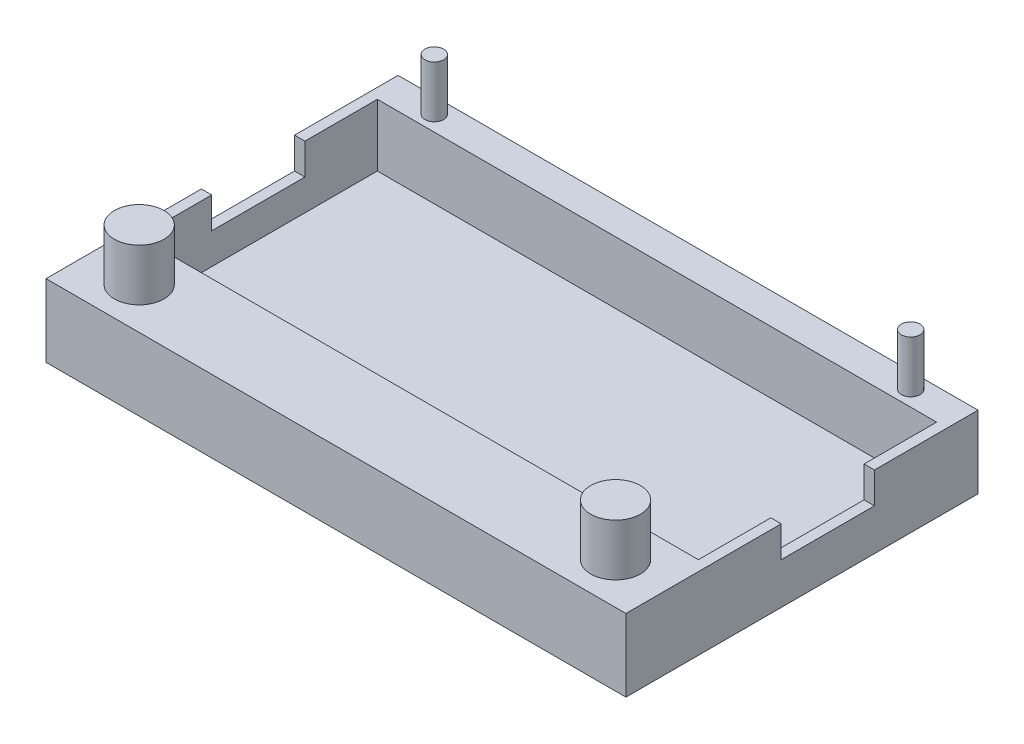
ISO-10303-21;
HEADER;
FILE_DESCRIPTION(('STEP AP214'),'2;1');
FILE_NAME('part.step','',(''),(''),'','','');
FILE_SCHEMA(('AUTOMOTIVE_DESIGN { 1 0 10303 214 1 1 1 1 }'));
ENDSEC;
DATA;
#1=APPLICATION_CONTEXT('core data for automotive mechanical design processes');
#2=APPLICATION_PROTOCOL_DEFINITION('international standard','automotive_design',2000,#1);
#3=PRODUCT_CONTEXT('',#1,'mechanical');
#4=PRODUCT('Part','Part','',(#3));
#5=PRODUCT_RELATED_PRODUCT_CATEGORY('part','',(#4));
#6=PRODUCT_DEFINITION_FORMATION('','',#4);
#7=PRODUCT_DEFINITION_CONTEXT('part definition',#1,'design');
#8=PRODUCT_DEFINITION('design','',#6,#7);
#9=PRODUCT_DEFINITION_SHAPE('','',#8);
#10=(LENGTH_UNIT() NAMED_UNIT(*) SI_UNIT(.MILLI.,.METRE.));
#11=(NAMED_UNIT(*) PLANE_ANGLE_UNIT() SI_UNIT($,.RADIAN.));
#12=(NAMED_UNIT(*) SI_UNIT($,.STERADIAN.) SOLID_ANGLE_UNIT());
#13=UNCERTAINTY_MEASURE_WITH_UNIT(LENGTH_MEASURE(1.E-05),#10,'distance_accuracy_value','');
#14=(GEOMETRIC_REPRESENTATION_CONTEXT(3) GLOBAL_UNCERTAINTY_ASSIGNED_CONTEXT((#13)) GLOBAL_UNIT_ASSIGNED_CONTEXT((#10,
#11,#12)) REPRESENTATION_CONTEXT('',''));
#15=CARTESIAN_POINT('',(0.,0.,0.));
#16=DIRECTION('',(0.,0.,1.));
#17=DIRECTION('',(1.,0.,0.));
#18=AXIS2_PLACEMENT_3D('',#15,#16,#17);
#19=CARTESIAN_POINT('',(0.,4.,0.));
#20=DIRECTION('',(0.,1.,0.));
#21=DIRECTION('',(0.,0.,1.));
#22=AXIS2_PLACEMENT_3D('',#19,#20,#21);
#23=PLANE('',#22);
#24=DIRECTION('',(0.,0.,-1.));
#25=VECTOR('',#24,1.);
#26=CARTESIAN_POINT('',(0.,4.,-32.));
#27=LINE('',#26,#25);
#28=CARTESIAN_POINT('',(0.,4.,-15.));
#29=VERTEX_POINT('',#28);
#30=CARTESIAN_POINT('',(0.,4.,-24.));
#31=VERTEX_POINT('',#30);
#32=EDGE_CURVE('E329',#29,#31,#27,.T.);
#33=ORIENTED_EDGE('',*,*,#32,.T.);
#34=DIRECTION('',(1.,0.,0.));
#35=VECTOR('',#34,1.);
#36=CARTESIAN_POINT('',(0.,4.,-24.));
#37=LINE('',#36,#35);
#38=CARTESIAN_POINT('',(-1.,4.,-24.));
#39=VERTEX_POINT('',#38);
#40=EDGE_CURVE('E188',#39,#31,#37,.T.);
#41=ORIENTED_EDGE('',*,*,#40,.F.);
#42=DIRECTION('',(0.,0.,-1.));
#43=VECTOR('',#42,1.);
#44=CARTESIAN_POINT('',(-1.,4.,-31.));
#45=LINE('',#44,#43);
#46=CARTESIAN_POINT('',(-1.,4.,-15.));
#47=VERTEX_POINT('',#46);
#48=EDGE_CURVE('E295',#47,#39,#45,.T.);
#49=ORIENTED_EDGE('',*,*,#48,.F.);
#50=DIRECTION('',(-1.,0.,0.));
#51=VECTOR('',#50,1.);
#52=CARTESIAN_POINT('',(0.,4.,-15.));
#53=LINE('',#52,#51);
#54=EDGE_CURVE('E69',#29,#47,#53,.T.);
#55=ORIENTED_EDGE('',*,*,#54,.F.);
#56=EDGE_LOOP('',(#33,#41,#49,#55));
#57=FACE_BOUND('',#56,.T.);
#58=ADVANCED_FACE('F45',(#57),#23,.T.);
#59=DIRECTION('',(0.,0.,1.));
#60=VECTOR('',#59,1.);
#61=CARTESIAN_POINT('',(-55.,4.,-31.));
#62=LINE('',#61,#60);
#63=CARTESIAN_POINT('',(-55.,4.,-24.));
#64=VERTEX_POINT('',#63);
#65=CARTESIAN_POINT('',(-55.,4.,-15.));
#66=VERTEX_POINT('',#65);
#67=EDGE_CURVE('E61',#64,#66,#62,.T.);
#68=ORIENTED_EDGE('',*,*,#67,.F.);
#69=DIRECTION('',(1.,0.,0.));
#70=VECTOR('',#69,1.);
#71=CARTESIAN_POINT('',(0.,4.,-24.));
#72=LINE('',#71,#70);
#73=CARTESIAN_POINT('',(-56.,4.,-24.));
#74=VERTEX_POINT('',#73);
#75=EDGE_CURVE('E211',#74,#64,#72,.T.);
#76=ORIENTED_EDGE('',*,*,#75,.F.);
#77=DIRECTION('',(0.,0.,1.));
#78=VECTOR('',#77,1.);
#79=CARTESIAN_POINT('',(-56.,4.,-32.));
#80=LINE('',#79,#78);
#81=CARTESIAN_POINT('',(-56.,4.,-15.));
#82=VERTEX_POINT('',#81);
#83=EDGE_CURVE('E326',#74,#82,#80,.T.);
#84=ORIENTED_EDGE('',*,*,#83,.T.);
#85=DIRECTION('',(-1.,0.,0.));
#86=VECTOR('',#85,1.);
#87=CARTESIAN_POINT('',(0.,4.,-15.));
#88=LINE('',#87,#86);
#89=EDGE_CURVE('E246',#66,#82,#88,.T.);
#90=ORIENTED_EDGE('',*,*,#89,.F.);
#91=EDGE_LOOP('',(#68,#76,#84,#90));
#92=FACE_BOUND('',#91,.T.);
#93=ADVANCED_FACE('F380',(#92),#23,.T.);
#94=CARTESIAN_POINT('',(-56.,1.,-32.));
#95=DIRECTION('',(1.,0.,0.));
#96=DIRECTION('',(0.,0.,-1.));
#97=AXIS2_PLACEMENT_3D('',#94,#95,#96);
#98=PLANE('',#97);
#99=DIRECTION('',(0.,0.,1.));
#100=VECTOR('',#99,1.);
#101=CARTESIAN_POINT('',(-56.,0.,-32.));
#102=LINE('',#101,#100);
#103=CARTESIAN_POINT('',(-56.,0.,-34.));
#104=VERTEX_POINT('',#103);
#105=CARTESIAN_POINT('',(-56.,0.,0.));
#106=VERTEX_POINT('',#105);
#107=EDGE_CURVE('E332',#104,#106,#102,.T.);
#108=ORIENTED_EDGE('',*,*,#107,.T.);
#109=DIRECTION('',(0.,-1.,0.));
#110=VECTOR('',#109,1.);
#111=CARTESIAN_POINT('',(-56.,1.,0.));
#112=LINE('',#111,#110);
#113=CARTESIAN_POINT('',(-56.,7.,0.));
#114=VERTEX_POINT('',#113);
#115=EDGE_CURVE('E11',#114,#106,#112,.T.);
#116=ORIENTED_EDGE('',*,*,#115,.F.);
#117=DIRECTION('',(0.,0.,-1.));
#118=VECTOR('',#117,1.);
#119=CARTESIAN_POINT('',(-56.,7.,0.));
#120=LINE('',#119,#118);
#121=CARTESIAN_POINT('',(-56.,7.,-15.));
#122=VERTEX_POINT('',#121);
#123=EDGE_CURVE('E263',#114,#122,#120,.T.);
#124=ORIENTED_EDGE('',*,*,#123,.T.);
#125=DIRECTION('',(0.,-1.,0.));
#126=VECTOR('',#125,1.);
#127=CARTESIAN_POINT('',(-56.,7.,-15.));
#128=LINE('',#127,#126);
#129=EDGE_CURVE('E271',#122,#82,#128,.T.);
#130=ORIENTED_EDGE('',*,*,#129,.T.);
#131=ORIENTED_EDGE('',*,*,#83,.F.);
#132=DIRECTION('',(0.,-1.,0.));
#133=VECTOR('',#132,1.);
#134=CARTESIAN_POINT('',(-56.,7.,-24.));
#135=LINE('',#134,#133);
#136=CARTESIAN_POINT('',(-56.,7.,-24.));
#137=VERTEX_POINT('',#136);
#138=EDGE_CURVE('E233',#137,#74,#135,.T.);
#139=ORIENTED_EDGE('',*,*,#138,.F.);
#140=DIRECTION('',(0.,0.,-1.));
#141=VECTOR('',#140,1.);
#142=CARTESIAN_POINT('',(-56.,7.,0.));
#143=LINE('',#142,#141);
#144=CARTESIAN_POINT('',(-56.,7.,-34.));
#145=VERTEX_POINT('',#144);
#146=EDGE_CURVE('E176',#137,#145,#143,.T.);
#147=ORIENTED_EDGE('',*,*,#146,.T.);
#148=DIRECTION('',(0.,-1.,0.));
#149=VECTOR('',#148,1.);
#150=CARTESIAN_POINT('',(-56.,7.,-34.));
#151=LINE('',#150,#149);
#152=EDGE_CURVE('E189',#145,#104,#151,.T.);
#153=ORIENTED_EDGE('',*,*,#152,.T.);
#154=EDGE_LOOP('',(#108,#116,#124,#130,#131,#139,#147,#153));
#155=FACE_BOUND('',#154,.T.);
#156=ADVANCED_FACE('F47',(#155),#98,.F.);
#157=CARTESIAN_POINT('',(-56.,1.,0.));
#158=DIRECTION('',(0.,0.,-1.));
#159=DIRECTION('',(-1.,0.,0.));
#160=AXIS2_PLACEMENT_3D('',#157,#158,#159);
#161=PLANE('',#160);
#162=DIRECTION('',(1.,0.,0.));
#163=VECTOR('',#162,1.);
#164=CARTESIAN_POINT('',(-56.,0.,0.));
#165=LINE('',#164,#163);
#166=CARTESIAN_POINT('',(0.,0.,0.));
#167=VERTEX_POINT('',#166);
#168=EDGE_CURVE('E336',#106,#167,#165,.T.);
#169=ORIENTED_EDGE('',*,*,#168,.T.);
#170=DIRECTION('',(0.,-1.,0.));
#171=VECTOR('',#170,1.);
#172=CARTESIAN_POINT('',(0.,1.,0.));
#173=LINE('',#172,#171);
#174=CARTESIAN_POINT('',(0.,7.,0.));
#175=VERTEX_POINT('',#174);
#176=EDGE_CURVE('E54',#175,#167,#173,.T.);
#177=ORIENTED_EDGE('',*,*,#176,.F.);
#178=DIRECTION('',(1.,0.,0.));
#179=VECTOR('',#178,1.);
#180=CARTESIAN_POINT('',(0.,7.,0.));
#181=LINE('',#180,#179);
#182=EDGE_CURVE('E267',#114,#175,#181,.T.);
#183=ORIENTED_EDGE('',*,*,#182,.F.);
#184=ORIENTED_EDGE('',*,*,#115,.T.);
#185=EDGE_LOOP('',(#169,#177,#183,#184));
#186=FACE_BOUND('',#185,.T.);
#187=ADVANCED_FACE('F374',(#186),#161,.F.);
#188=CARTESIAN_POINT('',(0.,1.,-32.));
#189=DIRECTION('',(-1.,0.,0.));
#190=DIRECTION('',(0.,0.,1.));
#191=AXIS2_PLACEMENT_3D('',#188,#189,#190);
#192=PLANE('',#191);
#193=DIRECTION('',(0.,0.,-1.));
#194=VECTOR('',#193,1.);
#195=CARTESIAN_POINT('',(0.,0.,-32.));
#196=LINE('',#195,#194);
#197=CARTESIAN_POINT('',(0.,0.,-34.));
#198=VERTEX_POINT('',#197);
#199=EDGE_CURVE('E183',#167,#198,#196,.T.);
#200=ORIENTED_EDGE('',*,*,#199,.T.);
#201=DIRECTION('',(0.,-1.,0.));
#202=VECTOR('',#201,1.);
#203=CARTESIAN_POINT('',(0.,7.,-34.));
#204=LINE('',#203,#202);
#205=CARTESIAN_POINT('',(0.,7.,-34.));
#206=VERTEX_POINT('',#205);
#207=EDGE_CURVE('E179',#206,#198,#204,.T.);
#208=ORIENTED_EDGE('',*,*,#207,.F.);
#209=DIRECTION('',(0.,0.,-1.));
#210=VECTOR('',#209,1.);
#211=CARTESIAN_POINT('',(0.,7.,0.));
#212=LINE('',#211,#210);
#213=CARTESIAN_POINT('',(0.,7.,-24.));
#214=VERTEX_POINT('',#213);
#215=EDGE_CURVE('E162',#214,#206,#212,.T.);
#216=ORIENTED_EDGE('',*,*,#215,.F.);
#217=DIRECTION('',(0.,-1.,0.));
#218=VECTOR('',#217,1.);
#219=CARTESIAN_POINT('',(0.,7.,-24.));
#220=LINE('',#219,#218);
#221=EDGE_CURVE('E236',#214,#31,#220,.T.);
#222=ORIENTED_EDGE('',*,*,#221,.T.);
#223=ORIENTED_EDGE('',*,*,#32,.F.);
#224=DIRECTION('',(0.,-1.,0.));
#225=VECTOR('',#224,1.);
#226=CARTESIAN_POINT('',(0.,7.,-15.));
#227=LINE('',#226,#225);
#228=CARTESIAN_POINT('',(0.,7.,-15.));
#229=VERTEX_POINT('',#228);
#230=EDGE_CURVE('E288',#229,#29,#227,.T.);
#231=ORIENTED_EDGE('',*,*,#230,.F.);
#232=DIRECTION('',(0.,0.,-1.));
#233=VECTOR('',#232,1.);
#234=CARTESIAN_POINT('',(0.,7.,0.));
#235=LINE('',#234,#233);
#236=EDGE_CURVE('E241',#175,#229,#235,.T.);
#237=ORIENTED_EDGE('',*,*,#236,.F.);
#238=ORIENTED_EDGE('',*,*,#176,.T.);
#239=EDGE_LOOP('',(#200,#208,#216,#222,#223,#231,#237,#238));
#240=FACE_BOUND('',#239,.T.);
#241=ADVANCED_FACE('F180',(#240),#192,.F.);
#242=CARTESIAN_POINT('',(0.,0.,0.));
#243=DIRECTION('',(0.,1.,0.));
#244=DIRECTION('',(0.,0.,1.));
#245=AXIS2_PLACEMENT_3D('',#242,#243,#244);
#246=PLANE('',#245);
#247=ORIENTED_EDGE('',*,*,#107,.F.);
#248=DIRECTION('',(-1.,0.,0.));
#249=VECTOR('',#248,1.);
#250=CARTESIAN_POINT('',(-56.,0.,-34.));
#251=LINE('',#250,#249);
#252=EDGE_CURVE('E194',#198,#104,#251,.T.);
#253=ORIENTED_EDGE('',*,*,#252,.F.);
#254=ORIENTED_EDGE('',*,*,#199,.F.);
#255=ORIENTED_EDGE('',*,*,#168,.F.);
#256=EDGE_LOOP('',(#247,#253,#254,#255));
#257=FACE_BOUND('',#256,.T.);
#258=ADVANCED_FACE('F346',(#257),#246,.F.);
#259=CARTESIAN_POINT('',(-55.,4.,-31.));
#260=DIRECTION('',(1.,0.,0.));
#261=DIRECTION('',(0.,0.,-1.));
#262=AXIS2_PLACEMENT_3D('',#259,#260,#261);
#263=PLANE('',#262);
#264=DIRECTION('',(0.,0.,1.));
#265=VECTOR('',#264,1.);
#266=CARTESIAN_POINT('',(-55.,1.,-31.));
#267=LINE('',#266,#265);
#268=CARTESIAN_POINT('',(-55.,1.,-31.));
#269=VERTEX_POINT('',#268);
#270=CARTESIAN_POINT('',(-55.,1.,-8.));
#271=VERTEX_POINT('',#270);
#272=EDGE_CURVE('E292',#269,#271,#267,.T.);
#273=ORIENTED_EDGE('',*,*,#272,.F.);
#274=DIRECTION('',(0.,-1.,0.));
#275=VECTOR('',#274,1.);
#276=CARTESIAN_POINT('',(-55.,4.,-31.));
#277=LINE('',#276,#275);
#278=CARTESIAN_POINT('',(-55.,7.,-31.));
#279=VERTEX_POINT('',#278);
#280=EDGE_CURVE('E300',#279,#269,#277,.T.);
#281=ORIENTED_EDGE('',*,*,#280,.F.);
#282=DIRECTION('',(0.,0.,-1.));
#283=VECTOR('',#282,1.);
#284=CARTESIAN_POINT('',(-55.,7.,0.));
#285=LINE('',#284,#283);
#286=CARTESIAN_POINT('',(-55.,7.,-24.));
#287=VERTEX_POINT('',#286);
#288=EDGE_CURVE('E218',#287,#279,#285,.T.);
#289=ORIENTED_EDGE('',*,*,#288,.F.);
#290=DIRECTION('',(0.,-1.,0.));
#291=VECTOR('',#290,1.);
#292=CARTESIAN_POINT('',(-55.,7.,-24.));
#293=LINE('',#292,#291);
#294=EDGE_CURVE('E226',#287,#64,#293,.T.);
#295=ORIENTED_EDGE('',*,*,#294,.T.);
#296=ORIENTED_EDGE('',*,*,#67,.T.);
#297=DIRECTION('',(0.,-1.,0.));
#298=VECTOR('',#297,1.);
#299=CARTESIAN_POINT('',(-55.,7.,-15.));
#300=LINE('',#299,#298);
#301=CARTESIAN_POINT('',(-55.,7.,-15.));
#302=VERTEX_POINT('',#301);
#303=EDGE_CURVE('E280',#302,#66,#300,.T.);
#304=ORIENTED_EDGE('',*,*,#303,.F.);
#305=DIRECTION('',(0.,0.,-1.));
#306=VECTOR('',#305,1.);
#307=CARTESIAN_POINT('',(-55.,7.,0.));
#308=LINE('',#307,#306);
#309=CARTESIAN_POINT('',(-55.,7.,-8.));
#310=VERTEX_POINT('',#309);
#311=EDGE_CURVE('E257',#310,#302,#308,.T.);
#312=ORIENTED_EDGE('',*,*,#311,.F.);
#313=DIRECTION('',(0.,-1.,0.));
#314=VECTOR('',#313,1.);
#315=CARTESIAN_POINT('',(-55.,4.,-8.));
#316=LINE('',#315,#314);
#317=EDGE_CURVE('E322',#310,#271,#316,.T.);
#318=ORIENTED_EDGE('',*,*,#317,.T.);
#319=EDGE_LOOP('',(#273,#281,#289,#295,#296,#304,#312,#318));
#320=FACE_BOUND('',#319,.T.);
#321=ADVANCED_FACE('F357',(#320),#263,.T.);
#322=CARTESIAN_POINT('',(-55.,4.,-8.));
#323=DIRECTION('',(0.,0.,-1.));
#324=DIRECTION('',(-1.,0.,0.));
#325=AXIS2_PLACEMENT_3D('',#322,#323,#324);
#326=PLANE('',#325);
#327=DIRECTION('',(1.,0.,0.));
#328=VECTOR('',#327,1.);
#329=CARTESIAN_POINT('',(-55.,1.,-8.));
#330=LINE('',#329,#328);
#331=CARTESIAN_POINT('',(-1.,1.,-8.));
#332=VERTEX_POINT('',#331);
#333=EDGE_CURVE('E303',#271,#332,#330,.T.);
#334=ORIENTED_EDGE('',*,*,#333,.F.);
#335=ORIENTED_EDGE('',*,*,#317,.F.);
#336=DIRECTION('',(1.,0.,0.));
#337=VECTOR('',#336,1.);
#338=CARTESIAN_POINT('',(0.,7.,-8.));
#339=LINE('',#338,#337);
#340=CARTESIAN_POINT('',(-1.,7.,-8.));
#341=VERTEX_POINT('',#340);
#342=EDGE_CURVE('E253',#310,#341,#339,.T.);
#343=ORIENTED_EDGE('',*,*,#342,.T.);
#344=DIRECTION('',(0.,-1.,0.));
#345=VECTOR('',#344,1.);
#346=CARTESIAN_POINT('',(-1.,4.,-8.));
#347=LINE('',#346,#345);
#348=EDGE_CURVE('E318',#341,#332,#347,.T.);
#349=ORIENTED_EDGE('',*,*,#348,.T.);
#350=EDGE_LOOP('',(#334,#335,#343,#349));
#351=FACE_BOUND('',#350,.T.);
#352=ADVANCED_FACE('F413',(#351),#326,.T.);
#353=CARTESIAN_POINT('',(-1.,4.,-31.));
#354=DIRECTION('',(-1.,0.,0.));
#355=DIRECTION('',(0.,0.,1.));
#356=AXIS2_PLACEMENT_3D('',#353,#354,#355);
#357=PLANE('',#356);
#358=DIRECTION('',(0.,0.,-1.));
#359=VECTOR('',#358,1.);
#360=CARTESIAN_POINT('',(-1.,1.,-31.));
#361=LINE('',#360,#359);
#362=CARTESIAN_POINT('',(-1.,1.,-31.));
#363=VERTEX_POINT('',#362);
#364=EDGE_CURVE('E306',#332,#363,#361,.T.);
#365=ORIENTED_EDGE('',*,*,#364,.F.);
#366=ORIENTED_EDGE('',*,*,#348,.F.);
#367=DIRECTION('',(0.,0.,-1.));
#368=VECTOR('',#367,1.);
#369=CARTESIAN_POINT('',(-1.,7.,0.));
#370=LINE('',#369,#368);
#371=CARTESIAN_POINT('',(-1.,7.,-15.));
#372=VERTEX_POINT('',#371);
#373=EDGE_CURVE('E249',#341,#372,#370,.T.);
#374=ORIENTED_EDGE('',*,*,#373,.T.);
#375=DIRECTION('',(0.,-1.,0.));
#376=VECTOR('',#375,1.);
#377=CARTESIAN_POINT('',(-1.,7.,-15.));
#378=LINE('',#377,#376);
#379=EDGE_CURVE('E284',#372,#47,#378,.T.);
#380=ORIENTED_EDGE('',*,*,#379,.T.);
#381=ORIENTED_EDGE('',*,*,#48,.T.);
#382=DIRECTION('',(0.,-1.,0.));
#383=VECTOR('',#382,1.);
#384=CARTESIAN_POINT('',(-1.,7.,-24.));
#385=LINE('',#384,#383);
#386=CARTESIAN_POINT('',(-1.,7.,-24.));
#387=VERTEX_POINT('',#386);
#388=EDGE_CURVE('E238',#387,#39,#385,.T.);
#389=ORIENTED_EDGE('',*,*,#388,.F.);
#390=DIRECTION('',(0.,0.,-1.));
#391=VECTOR('',#390,1.);
#392=CARTESIAN_POINT('',(-1.,7.,0.));
#393=LINE('',#392,#391);
#394=CARTESIAN_POINT('',(-1.,7.,-31.));
#395=VERTEX_POINT('',#394);
#396=EDGE_CURVE('E207',#387,#395,#393,.T.);
#397=ORIENTED_EDGE('',*,*,#396,.T.);
#398=DIRECTION('',(0.,-1.,0.));
#399=VECTOR('',#398,1.);
#400=CARTESIAN_POINT('',(-1.,4.,-31.));
#401=LINE('',#400,#399);
#402=EDGE_CURVE('E314',#395,#363,#401,.T.);
#403=ORIENTED_EDGE('',*,*,#402,.T.);
#404=EDGE_LOOP('',(#365,#366,#374,#380,#381,#389,#397,#403));
#405=FACE_BOUND('',#404,.T.);
#406=ADVANCED_FACE('F363',(#405),#357,.T.);
#407=CARTESIAN_POINT('',(-55.,4.,-31.));
#408=DIRECTION('',(0.,0.,1.));
#409=DIRECTION('',(1.,0.,0.));
#410=AXIS2_PLACEMENT_3D('',#407,#408,#409);
#411=PLANE('',#410);
#412=DIRECTION('',(-1.,0.,0.));
#413=VECTOR('',#412,1.);
#414=CARTESIAN_POINT('',(-55.,1.,-31.));
#415=LINE('',#414,#413);
#416=EDGE_CURVE('E296',#363,#269,#415,.T.);
#417=ORIENTED_EDGE('',*,*,#416,.F.);
#418=ORIENTED_EDGE('',*,*,#402,.F.);
#419=DIRECTION('',(1.,0.,0.));
#420=VECTOR('',#419,1.);
#421=CARTESIAN_POINT('',(0.,7.,-31.));
#422=LINE('',#421,#420);
#423=EDGE_CURVE('E222',#279,#395,#422,.T.);
#424=ORIENTED_EDGE('',*,*,#423,.F.);
#425=ORIENTED_EDGE('',*,*,#280,.T.);
#426=EDGE_LOOP('',(#417,#418,#424,#425));
#427=FACE_BOUND('',#426,.T.);
#428=ADVANCED_FACE('F360',(#427),#411,.T.);
#429=CARTESIAN_POINT('',(0.,1.,0.));
#430=DIRECTION('',(0.,1.,0.));
#431=DIRECTION('',(0.,0.,1.));
#432=AXIS2_PLACEMENT_3D('',#429,#430,#431);
#433=PLANE('',#432);
#434=ORIENTED_EDGE('',*,*,#272,.T.);
#435=ORIENTED_EDGE('',*,*,#333,.T.);
#436=ORIENTED_EDGE('',*,*,#364,.T.);
#437=ORIENTED_EDGE('',*,*,#416,.T.);
#438=EDGE_LOOP('',(#434,#435,#436,#437));
#439=FACE_BOUND('',#438,.T.);
#440=ADVANCED_FACE('F390',(#439),#433,.T.);
#441=CARTESIAN_POINT('',(0.,7.,-15.));
#442=DIRECTION('',(0.,0.,1.));
#443=DIRECTION('',(1.,0.,0.));
#444=AXIS2_PLACEMENT_3D('',#441,#442,#443);
#445=PLANE('',#444);
#446=ORIENTED_EDGE('',*,*,#54,.T.);
#447=ORIENTED_EDGE('',*,*,#379,.F.);
#448=DIRECTION('',(-1.,0.,0.));
#449=VECTOR('',#448,1.);
#450=CARTESIAN_POINT('',(0.,7.,-15.));
#451=LINE('',#450,#449);
#452=EDGE_CURVE('E245',#229,#372,#451,.T.);
#453=ORIENTED_EDGE('',*,*,#452,.F.);
#454=ORIENTED_EDGE('',*,*,#230,.T.);
#455=EDGE_LOOP('',(#446,#447,#453,#454));
#456=FACE_BOUND('',#455,.T.);
#457=ADVANCED_FACE('F370',(#456),#445,.F.);
#458=CARTESIAN_POINT('',(0.,7.,-15.));
#459=DIRECTION('',(0.,0.,1.));
#460=DIRECTION('',(1.,0.,0.));
#461=AXIS2_PLACEMENT_3D('',#458,#459,#460);
#462=PLANE('',#461);
#463=ORIENTED_EDGE('',*,*,#89,.T.);
#464=ORIENTED_EDGE('',*,*,#129,.F.);
#465=DIRECTION('',(-1.,0.,0.));
#466=VECTOR('',#465,1.);
#467=CARTESIAN_POINT('',(0.,7.,-15.));
#468=LINE('',#467,#466);
#469=EDGE_CURVE('E260',#302,#122,#468,.T.);
#470=ORIENTED_EDGE('',*,*,#469,.F.);
#471=ORIENTED_EDGE('',*,*,#303,.T.);
#472=EDGE_LOOP('',(#463,#464,#470,#471));
#473=FACE_BOUND('',#472,.T.);
#474=ADVANCED_FACE('F378',(#473),#462,.F.);
#475=CARTESIAN_POINT('',(0.,7.,0.));
#476=DIRECTION('',(0.,1.,0.));
#477=DIRECTION('',(0.,0.,1.));
#478=AXIS2_PLACEMENT_3D('',#475,#476,#477);
#479=PLANE('',#478);
#480=CARTESIAN_POINT('',(-5.,7.,-4.));
#481=DIRECTION('',(0.,1.,0.));
#482=DIRECTION('',(0.,0.,1.));
#483=AXIS2_PLACEMENT_3D('',#480,#481,#482);
#484=CIRCLE('',#483,2.4);
#485=CARTESIAN_POINT('',(-5.,7.,-1.6));
#486=VERTEX_POINT('',#485);
#487=EDGE_CURVE('E765',#486,#486,#484,.T.);
#488=ORIENTED_EDGE('',*,*,#487,.F.);
#489=EDGE_LOOP('',(#488));
#490=FACE_BOUND('',#489,.T.);
#491=CARTESIAN_POINT('',(-51.,7.,-4.));
#492=DIRECTION('',(0.,1.,0.));
#493=DIRECTION('',(0.,0.,1.));
#494=AXIS2_PLACEMENT_3D('',#491,#492,#493);
#495=CIRCLE('',#494,2.4);
#496=CARTESIAN_POINT('',(-51.,7.,-1.6));
#497=VERTEX_POINT('',#496);
#498=EDGE_CURVE('E204',#497,#497,#495,.T.);
#499=ORIENTED_EDGE('',*,*,#498,.F.);
#500=EDGE_LOOP('',(#499));
#501=FACE_BOUND('',#500,.T.);
#502=ORIENTED_EDGE('',*,*,#236,.T.);
#503=ORIENTED_EDGE('',*,*,#452,.T.);
#504=ORIENTED_EDGE('',*,*,#373,.F.);
#505=ORIENTED_EDGE('',*,*,#342,.F.);
#506=ORIENTED_EDGE('',*,*,#311,.T.);
#507=ORIENTED_EDGE('',*,*,#469,.T.);
#508=ORIENTED_EDGE('',*,*,#123,.F.);
#509=ORIENTED_EDGE('',*,*,#182,.T.);
#510=EDGE_LOOP('',(#502,#503,#504,#505,#506,#507,#508,#509));
#511=FACE_BOUND('',#510,.T.);
#512=ADVANCED_FACE('F372',(#490,#501,#511),#479,.T.);
#513=CARTESIAN_POINT('',(0.,7.,-24.));
#514=DIRECTION('',(0.,0.,-1.));
#515=DIRECTION('',(-1.,0.,0.));
#516=AXIS2_PLACEMENT_3D('',#513,#514,#515);
#517=PLANE('',#516);
#518=ORIENTED_EDGE('',*,*,#40,.T.);
#519=ORIENTED_EDGE('',*,*,#221,.F.);
#520=DIRECTION('',(1.,0.,0.));
#521=VECTOR('',#520,1.);
#522=CARTESIAN_POINT('',(0.,7.,-24.));
#523=LINE('',#522,#521);
#524=EDGE_CURVE('E171',#387,#214,#523,.T.);
#525=ORIENTED_EDGE('',*,*,#524,.F.);
#526=ORIENTED_EDGE('',*,*,#388,.T.);
#527=EDGE_LOOP('',(#518,#519,#525,#526));
#528=FACE_BOUND('',#527,.T.);
#529=ADVANCED_FACE('F366',(#528),#517,.F.);
#530=CARTESIAN_POINT('',(0.,7.,-24.));
#531=DIRECTION('',(0.,0.,-1.));
#532=DIRECTION('',(-1.,0.,0.));
#533=AXIS2_PLACEMENT_3D('',#530,#531,#532);
#534=PLANE('',#533);
#535=ORIENTED_EDGE('',*,*,#75,.T.);
#536=ORIENTED_EDGE('',*,*,#294,.F.);
#537=DIRECTION('',(1.,0.,0.));
#538=VECTOR('',#537,1.);
#539=CARTESIAN_POINT('',(0.,7.,-24.));
#540=LINE('',#539,#538);
#541=EDGE_CURVE('E216',#137,#287,#540,.T.);
#542=ORIENTED_EDGE('',*,*,#541,.F.);
#543=ORIENTED_EDGE('',*,*,#138,.T.);
#544=EDGE_LOOP('',(#535,#536,#542,#543));
#545=FACE_BOUND('',#544,.T.);
#546=ADVANCED_FACE('F354',(#545),#534,.F.);
#547=CARTESIAN_POINT('',(0.,7.,0.));
#548=DIRECTION('',(0.,1.,0.));
#549=DIRECTION('',(0.,0.,1.));
#550=AXIS2_PLACEMENT_3D('',#547,#548,#549);
#551=PLANE('',#550);
#552=CARTESIAN_POINT('',(-5.,7.,-32.5));
#553=DIRECTION('',(0.,1.,0.));
#554=DIRECTION('',(0.,0.,1.));
#555=AXIS2_PLACEMENT_3D('',#552,#553,#554);
#556=CIRCLE('',#555,0.899999999999999);
#557=CARTESIAN_POINT('',(-5.,7.,-31.6));
#558=VERTEX_POINT('',#557);
#559=EDGE_CURVE('E750',#558,#558,#556,.T.);
#560=ORIENTED_EDGE('',*,*,#559,.F.);
#561=EDGE_LOOP('',(#560));
#562=FACE_BOUND('',#561,.T.);
#563=CARTESIAN_POINT('',(-51.,7.,-32.5));
#564=DIRECTION('',(0.,1.,0.));
#565=DIRECTION('',(0.,0.,1.));
#566=AXIS2_PLACEMENT_3D('',#563,#564,#565);
#567=CIRCLE('',#566,0.899999999999996);
#568=CARTESIAN_POINT('',(-51.,7.,-31.6));
#569=VERTEX_POINT('',#568);
#570=EDGE_CURVE('E757',#569,#569,#567,.T.);
#571=ORIENTED_EDGE('',*,*,#570,.F.);
#572=EDGE_LOOP('',(#571));
#573=FACE_BOUND('',#572,.T.);
#574=ORIENTED_EDGE('',*,*,#396,.F.);
#575=ORIENTED_EDGE('',*,*,#524,.T.);
#576=ORIENTED_EDGE('',*,*,#215,.T.);
#577=DIRECTION('',(-1.,0.,0.));
#578=VECTOR('',#577,1.);
#579=CARTESIAN_POINT('',(-56.,7.,-34.));
#580=LINE('',#579,#578);
#581=EDGE_CURVE('E168',#206,#145,#580,.T.);
#582=ORIENTED_EDGE('',*,*,#581,.T.);
#583=ORIENTED_EDGE('',*,*,#146,.F.);
#584=ORIENTED_EDGE('',*,*,#541,.T.);
#585=ORIENTED_EDGE('',*,*,#288,.T.);
#586=ORIENTED_EDGE('',*,*,#423,.T.);
#587=EDGE_LOOP('',(#574,#575,#576,#582,#583,#584,#585,#586));
#588=FACE_BOUND('',#587,.T.);
#589=ADVANCED_FACE('F165',(#562,#573,#588),#551,.T.);
#590=CARTESIAN_POINT('',(-56.,7.,-34.));
#591=DIRECTION('',(0.,0.,1.));
#592=DIRECTION('',(1.,0.,0.));
#593=AXIS2_PLACEMENT_3D('',#590,#591,#592);
#594=PLANE('',#593);
#595=ORIENTED_EDGE('',*,*,#252,.T.);
#596=ORIENTED_EDGE('',*,*,#152,.F.);
#597=ORIENTED_EDGE('',*,*,#581,.F.);
#598=ORIENTED_EDGE('',*,*,#207,.T.);
#599=EDGE_LOOP('',(#595,#596,#597,#598));
#600=FACE_BOUND('',#599,.T.);
#601=ADVANCED_FACE('F191',(#600),#594,.F.);
#602=CARTESIAN_POINT('',(-51.,12.,-4.));
#603=DIRECTION('',(0.,-1.,0.));
#604=DIRECTION('',(0.,0.,-1.));
#605=AXIS2_PLACEMENT_3D('',#602,#603,#604);
#606=CYLINDRICAL_SURFACE('',#605,2.4);
#607=CARTESIAN_POINT('',(-51.,12.,-4.));
#608=DIRECTION('',(0.,1.,0.));
#609=DIRECTION('',(0.,0.,1.));
#610=AXIS2_PLACEMENT_3D('',#607,#608,#609);
#611=CIRCLE('',#610,2.4);
#612=CARTESIAN_POINT('',(-51.,12.,-1.6));
#613=VERTEX_POINT('',#612);
#614=EDGE_CURVE('E201',#613,#613,#611,.T.);
#615=ORIENTED_EDGE('',*,*,#614,.F.);
#616=EDGE_LOOP('',(#615));
#617=FACE_BOUND('',#616,.T.);
#618=ORIENTED_EDGE('',*,*,#498,.T.);
#619=EDGE_LOOP('',(#618));
#620=FACE_BOUND('',#619,.T.);
#621=ADVANCED_FACE('F468',(#617,#620),#606,.T.);
#622=CARTESIAN_POINT('',(-51.,12.,-4.));
#623=DIRECTION('',(0.,1.,0.));
#624=DIRECTION('',(0.,0.,1.));
#625=AXIS2_PLACEMENT_3D('',#622,#623,#624);
#626=PLANE('',#625);
#627=ORIENTED_EDGE('',*,*,#614,.T.);
#628=EDGE_LOOP('',(#627));
#629=FACE_BOUND('',#628,.T.);
#630=ADVANCED_FACE('F474',(#629),#626,.T.);
#631=CARTESIAN_POINT('',(-5.,12.,-4.));
#632=DIRECTION('',(0.,-1.,0.));
#633=DIRECTION('',(0.,0.,-1.));
#634=AXIS2_PLACEMENT_3D('',#631,#632,#633);
#635=CYLINDRICAL_SURFACE('',#634,2.4);
#636=CARTESIAN_POINT('',(-5.,12.,-4.));
#637=DIRECTION('',(0.,1.,0.));
#638=DIRECTION('',(0.,0.,1.));
#639=AXIS2_PLACEMENT_3D('',#636,#637,#638);
#640=CIRCLE('',#639,2.4);
#641=CARTESIAN_POINT('',(-5.,12.,-1.6));
#642=VERTEX_POINT('',#641);
#643=EDGE_CURVE('E761',#642,#642,#640,.T.);
#644=ORIENTED_EDGE('',*,*,#643,.F.);
#645=EDGE_LOOP('',(#644));
#646=FACE_BOUND('',#645,.T.);
#647=ORIENTED_EDGE('',*,*,#487,.T.);
#648=EDGE_LOOP('',(#647));
#649=FACE_BOUND('',#648,.T.);
#650=ADVANCED_FACE('F481',(#646,#649),#635,.T.);
#651=CARTESIAN_POINT('',(-5.,12.,-4.));
#652=DIRECTION('',(0.,1.,0.));
#653=DIRECTION('',(0.,0.,1.));
#654=AXIS2_PLACEMENT_3D('',#651,#652,#653);
#655=PLANE('',#654);
#656=ORIENTED_EDGE('',*,*,#643,.T.);
#657=EDGE_LOOP('',(#656));
#658=FACE_BOUND('',#657,.T.);
#659=ADVANCED_FACE('F488',(#658),#655,.T.);
#660=CARTESIAN_POINT('',(-51.,12.,-32.5));
#661=DIRECTION('',(0.,-1.,0.));
#662=DIRECTION('',(0.,0.,-1.));
#663=AXIS2_PLACEMENT_3D('',#660,#661,#662);
#664=CYLINDRICAL_SURFACE('',#663,0.899999999999996);
#665=CARTESIAN_POINT('',(-51.,12.,-32.5));
#666=DIRECTION('',(0.,1.,0.));
#667=DIRECTION('',(0.,0.,1.));
#668=AXIS2_PLACEMENT_3D('',#665,#666,#667);
#669=CIRCLE('',#668,0.899999999999996);
#670=CARTESIAN_POINT('',(-51.,12.,-31.6));
#671=VERTEX_POINT('',#670);
#672=EDGE_CURVE('E754',#671,#671,#669,.T.);
#673=ORIENTED_EDGE('',*,*,#672,.F.);
#674=EDGE_LOOP('',(#673));
#675=FACE_BOUND('',#674,.T.);
#676=ORIENTED_EDGE('',*,*,#570,.T.);
#677=EDGE_LOOP('',(#676));
#678=FACE_BOUND('',#677,.T.);
#679=ADVANCED_FACE('F495',(#675,#678),#664,.T.);
#680=CARTESIAN_POINT('',(-51.,12.,-32.5));
#681=DIRECTION('',(0.,1.,0.));
#682=DIRECTION('',(0.,0.,1.));
#683=AXIS2_PLACEMENT_3D('',#680,#681,#682);
#684=PLANE('',#683);
#685=ORIENTED_EDGE('',*,*,#672,.T.);
#686=EDGE_LOOP('',(#685));
#687=FACE_BOUND('',#686,.T.);
#688=ADVANCED_FACE('F502',(#687),#684,.T.);
#689=CARTESIAN_POINT('',(-5.,12.,-32.5));
#690=DIRECTION('',(0.,-1.,0.));
#691=DIRECTION('',(0.,0.,-1.));
#692=AXIS2_PLACEMENT_3D('',#689,#690,#691);
#693=CYLINDRICAL_SURFACE('',#692,0.899999999999999);
#694=CARTESIAN_POINT('',(-5.,12.,-32.5));
#695=DIRECTION('',(0.,1.,0.));
#696=DIRECTION('',(0.,0.,1.));
#697=AXIS2_PLACEMENT_3D('',#694,#695,#696);
#698=CIRCLE('',#697,0.899999999999999);
#699=CARTESIAN_POINT('',(-5.,12.,-31.6));
#700=VERTEX_POINT('',#699);
#701=EDGE_CURVE('E748',#700,#700,#698,.T.);
#702=ORIENTED_EDGE('',*,*,#701,.F.);
#703=EDGE_LOOP('',(#702));
#704=FACE_BOUND('',#703,.T.);
#705=ORIENTED_EDGE('',*,*,#559,.T.);
#706=EDGE_LOOP('',(#705));
#707=FACE_BOUND('',#706,.T.);
#708=ADVANCED_FACE('F509',(#704,#707),#693,.T.);
#709=CARTESIAN_POINT('',(-5.,12.,-32.5));
#710=DIRECTION('',(0.,1.,0.));
#711=DIRECTION('',(0.,0.,1.));
#712=AXIS2_PLACEMENT_3D('',#709,#710,#711);
#713=PLANE('',#712);
#714=ORIENTED_EDGE('',*,*,#701,.T.);
#715=EDGE_LOOP('',(#714));
#716=FACE_BOUND('',#715,.T.);
#717=ADVANCED_FACE('F516',(#716),#713,.T.);
#718=CLOSED_SHELL('',(#58,#93,#156,#187,#241,#258,#321,#352,#406,#428,#440,#457,#474,#512,#529,
#546,#589,#601,#621,#630,#650,#659,#679,#688,#708,#717));
#719=MANIFOLD_SOLID_BREP('B2',#718);
#720=ADVANCED_BREP_SHAPE_REPRESENTATION('',(#18,#719),#14);
#721=SHAPE_DEFINITION_REPRESENTATION(#9,#720);
ENDSEC;
END-ISO-10303-21;
